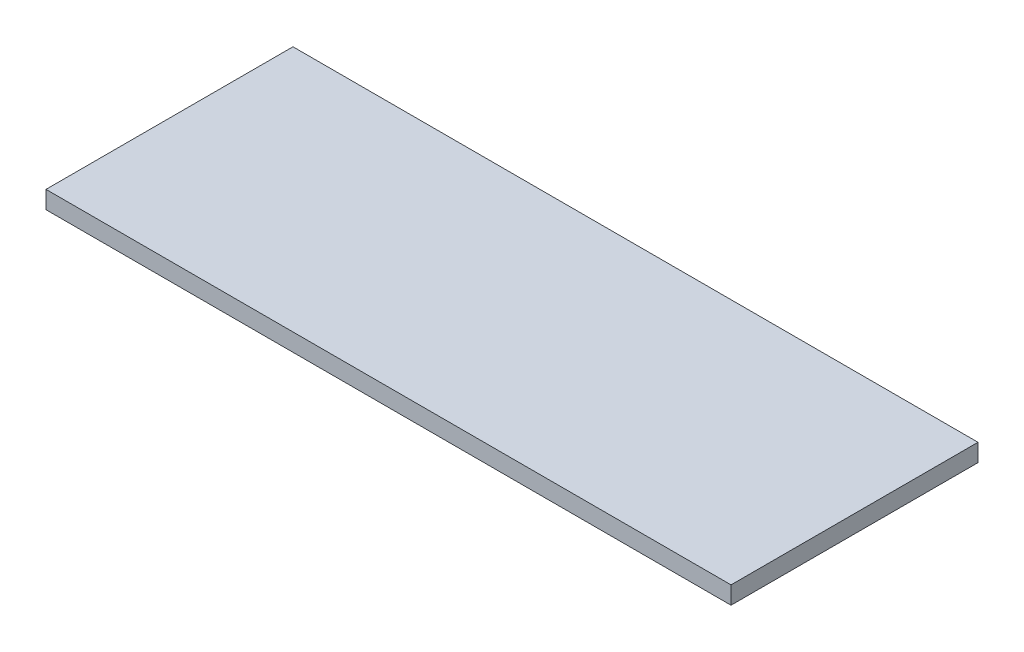
ISO-10303-21;
HEADER;
FILE_DESCRIPTION(('STEP AP214'),'2;1');
FILE_NAME('part.step','',(''),(''),'','','');
FILE_SCHEMA(('AUTOMOTIVE_DESIGN { 1 0 10303 214 1 1 1 1 }'));
ENDSEC;
DATA;
#1=APPLICATION_CONTEXT('core data for automotive mechanical design processes');
#2=APPLICATION_PROTOCOL_DEFINITION('international standard','automotive_design',2000,#1);
#3=PRODUCT_CONTEXT('',#1,'mechanical');
#4=PRODUCT('Part','Part','',(#3));
#5=PRODUCT_RELATED_PRODUCT_CATEGORY('part','',(#4));
#6=PRODUCT_DEFINITION_FORMATION('','',#4);
#7=PRODUCT_DEFINITION_CONTEXT('part definition',#1,'design');
#8=PRODUCT_DEFINITION('design','',#6,#7);
#9=PRODUCT_DEFINITION_SHAPE('','',#8);
#10=(LENGTH_UNIT() NAMED_UNIT(*) SI_UNIT(.MILLI.,.METRE.));
#11=(NAMED_UNIT(*) PLANE_ANGLE_UNIT() SI_UNIT($,.RADIAN.));
#12=(NAMED_UNIT(*) SI_UNIT($,.STERADIAN.) SOLID_ANGLE_UNIT());
#13=UNCERTAINTY_MEASURE_WITH_UNIT(LENGTH_MEASURE(1.E-05),#10,'distance_accuracy_value','');
#14=(GEOMETRIC_REPRESENTATION_CONTEXT(3) GLOBAL_UNCERTAINTY_ASSIGNED_CONTEXT((#13)) GLOBAL_UNIT_ASSIGNED_CONTEXT((#10,
#11,#12)) REPRESENTATION_CONTEXT('',''));
#15=CARTESIAN_POINT('',(0.,0.,0.));
#16=DIRECTION('',(0.,0.,1.));
#17=DIRECTION('',(1.,0.,0.));
#18=AXIS2_PLACEMENT_3D('',#15,#16,#17);
#19=CARTESIAN_POINT('',(58.25,3.,21.));
#20=DIRECTION('',(-1.,0.,0.));
#21=DIRECTION('',(0.,0.,1.));
#22=AXIS2_PLACEMENT_3D('',#19,#20,#21);
#23=PLANE('',#22);
#24=DIRECTION('',(0.,0.,-1.));
#25=VECTOR('',#24,1.);
#26=CARTESIAN_POINT('',(58.25,0.,21.));
#27=LINE('',#26,#25);
#28=CARTESIAN_POINT('',(58.25,0.,21.));
#29=VERTEX_POINT('',#28);
#30=CARTESIAN_POINT('',(58.25,0.,-21.));
#31=VERTEX_POINT('',#30);
#32=EDGE_CURVE('E130',#29,#31,#27,.T.);
#33=ORIENTED_EDGE('',*,*,#32,.T.);
#34=DIRECTION('',(0.,-1.,0.));
#35=VECTOR('',#34,1.);
#36=CARTESIAN_POINT('',(58.25,3.,-21.));
#37=LINE('',#36,#35);
#38=CARTESIAN_POINT('',(58.25,3.,-21.));
#39=VERTEX_POINT('',#38);
#40=EDGE_CURVE('E12',#39,#31,#37,.T.);
#41=ORIENTED_EDGE('',*,*,#40,.F.);
#42=DIRECTION('',(0.,0.,-1.));
#43=VECTOR('',#42,1.);
#44=CARTESIAN_POINT('',(58.25,3.,21.));
#45=LINE('',#44,#43);
#46=CARTESIAN_POINT('',(58.25,3.,21.));
#47=VERTEX_POINT('',#46);
#48=EDGE_CURVE('E94',#47,#39,#45,.T.);
#49=ORIENTED_EDGE('',*,*,#48,.F.);
#50=DIRECTION('',(0.,-1.,0.));
#51=VECTOR('',#50,1.);
#52=CARTESIAN_POINT('',(58.25,3.,21.));
#53=LINE('',#52,#51);
#54=EDGE_CURVE('E106',#47,#29,#53,.T.);
#55=ORIENTED_EDGE('',*,*,#54,.T.);
#56=EDGE_LOOP('',(#33,#41,#49,#55));
#57=FACE_BOUND('',#56,.T.);
#58=ADVANCED_FACE('F42',(#57),#23,.F.);
#59=CARTESIAN_POINT('',(-58.25,3.,-21.));
#60=DIRECTION('',(0.,0.,1.));
#61=DIRECTION('',(1.,0.,0.));
#62=AXIS2_PLACEMENT_3D('',#59,#60,#61);
#63=PLANE('',#62);
#64=DIRECTION('',(-1.,0.,0.));
#65=VECTOR('',#64,1.);
#66=CARTESIAN_POINT('',(-58.25,0.,-21.));
#67=LINE('',#66,#65);
#68=CARTESIAN_POINT('',(-58.25,0.,-21.));
#69=VERTEX_POINT('',#68);
#70=EDGE_CURVE('E99',#31,#69,#67,.T.);
#71=ORIENTED_EDGE('',*,*,#70,.T.);
#72=DIRECTION('',(0.,-1.,0.));
#73=VECTOR('',#72,1.);
#74=CARTESIAN_POINT('',(-58.25,3.,-21.));
#75=LINE('',#74,#73);
#76=CARTESIAN_POINT('',(-58.25,3.,-21.));
#77=VERTEX_POINT('',#76);
#78=EDGE_CURVE('E51',#77,#69,#75,.T.);
#79=ORIENTED_EDGE('',*,*,#78,.F.);
#80=DIRECTION('',(-1.,0.,0.));
#81=VECTOR('',#80,1.);
#82=CARTESIAN_POINT('',(-58.25,3.,-21.));
#83=LINE('',#82,#81);
#84=EDGE_CURVE('E89',#39,#77,#83,.T.);
#85=ORIENTED_EDGE('',*,*,#84,.F.);
#86=ORIENTED_EDGE('',*,*,#40,.T.);
#87=EDGE_LOOP('',(#71,#79,#85,#86));
#88=FACE_BOUND('',#87,.T.);
#89=ADVANCED_FACE('F98',(#88),#63,.F.);
#90=CARTESIAN_POINT('',(-58.25,3.,21.));
#91=DIRECTION('',(1.,0.,0.));
#92=DIRECTION('',(0.,0.,-1.));
#93=AXIS2_PLACEMENT_3D('',#90,#91,#92);
#94=PLANE('',#93);
#95=DIRECTION('',(0.,0.,1.));
#96=VECTOR('',#95,1.);
#97=CARTESIAN_POINT('',(-58.25,0.,21.));
#98=LINE('',#97,#96);
#99=CARTESIAN_POINT('',(-58.25,0.,21.));
#100=VERTEX_POINT('',#99);
#101=EDGE_CURVE('E76',#69,#100,#98,.T.);
#102=ORIENTED_EDGE('',*,*,#101,.T.);
#103=DIRECTION('',(0.,-1.,0.));
#104=VECTOR('',#103,1.);
#105=CARTESIAN_POINT('',(-58.25,3.,21.));
#106=LINE('',#105,#104);
#107=CARTESIAN_POINT('',(-58.25,3.,21.));
#108=VERTEX_POINT('',#107);
#109=EDGE_CURVE('E101',#108,#100,#106,.T.);
#110=ORIENTED_EDGE('',*,*,#109,.F.);
#111=DIRECTION('',(0.,0.,1.));
#112=VECTOR('',#111,1.);
#113=CARTESIAN_POINT('',(-58.25,3.,21.));
#114=LINE('',#113,#112);
#115=EDGE_CURVE('E92',#77,#108,#114,.T.);
#116=ORIENTED_EDGE('',*,*,#115,.F.);
#117=ORIENTED_EDGE('',*,*,#78,.T.);
#118=EDGE_LOOP('',(#102,#110,#116,#117));
#119=FACE_BOUND('',#118,.T.);
#120=ADVANCED_FACE('F102',(#119),#94,.F.);
#121=CARTESIAN_POINT('',(-58.25,3.,21.));
#122=DIRECTION('',(0.,0.,-1.));
#123=DIRECTION('',(-1.,0.,0.));
#124=AXIS2_PLACEMENT_3D('',#121,#122,#123);
#125=PLANE('',#124);
#126=DIRECTION('',(1.,0.,0.));
#127=VECTOR('',#126,1.);
#128=CARTESIAN_POINT('',(-58.25,0.,21.));
#129=LINE('',#128,#127);
#130=EDGE_CURVE('E82',#100,#29,#129,.T.);
#131=ORIENTED_EDGE('',*,*,#130,.T.);
#132=ORIENTED_EDGE('',*,*,#54,.F.);
#133=DIRECTION('',(1.,0.,0.));
#134=VECTOR('',#133,1.);
#135=CARTESIAN_POINT('',(-58.25,3.,21.));
#136=LINE('',#135,#134);
#137=EDGE_CURVE('E59',#108,#47,#136,.T.);
#138=ORIENTED_EDGE('',*,*,#137,.F.);
#139=ORIENTED_EDGE('',*,*,#109,.T.);
#140=EDGE_LOOP('',(#131,#132,#138,#139));
#141=FACE_BOUND('',#140,.T.);
#142=ADVANCED_FACE('F125',(#141),#125,.F.);
#143=CARTESIAN_POINT('',(0.,3.,0.));
#144=DIRECTION('',(0.,-1.,0.));
#145=DIRECTION('',(0.,0.,-1.));
#146=AXIS2_PLACEMENT_3D('',#143,#144,#145);
#147=PLANE('',#146);
#148=ORIENTED_EDGE('',*,*,#48,.T.);
#149=ORIENTED_EDGE('',*,*,#84,.T.);
#150=ORIENTED_EDGE('',*,*,#115,.T.);
#151=ORIENTED_EDGE('',*,*,#137,.T.);
#152=EDGE_LOOP('',(#148,#149,#150,#151));
#153=FACE_BOUND('',#152,.T.);
#154=ADVANCED_FACE('F90',(#153),#147,.F.);
#155=CARTESIAN_POINT('',(0.,0.,0.));
#156=DIRECTION('',(0.,-1.,0.));
#157=DIRECTION('',(0.,0.,-1.));
#158=AXIS2_PLACEMENT_3D('',#155,#156,#157);
#159=PLANE('',#158);
#160=ORIENTED_EDGE('',*,*,#32,.F.);
#161=ORIENTED_EDGE('',*,*,#130,.F.);
#162=ORIENTED_EDGE('',*,*,#101,.F.);
#163=ORIENTED_EDGE('',*,*,#70,.F.);
#164=EDGE_LOOP('',(#160,#161,#162,#163));
#165=FACE_BOUND('',#164,.T.);
#166=ADVANCED_FACE('F128',(#165),#159,.T.);
#167=CLOSED_SHELL('',(#58,#89,#120,#142,#154,#166));
#168=MANIFOLD_SOLID_BREP('B2',#167);
#169=ADVANCED_BREP_SHAPE_REPRESENTATION('',(#18,#168),#14);
#170=SHAPE_DEFINITION_REPRESENTATION(#9,#169);
ENDSEC;
END-ISO-10303-21;
